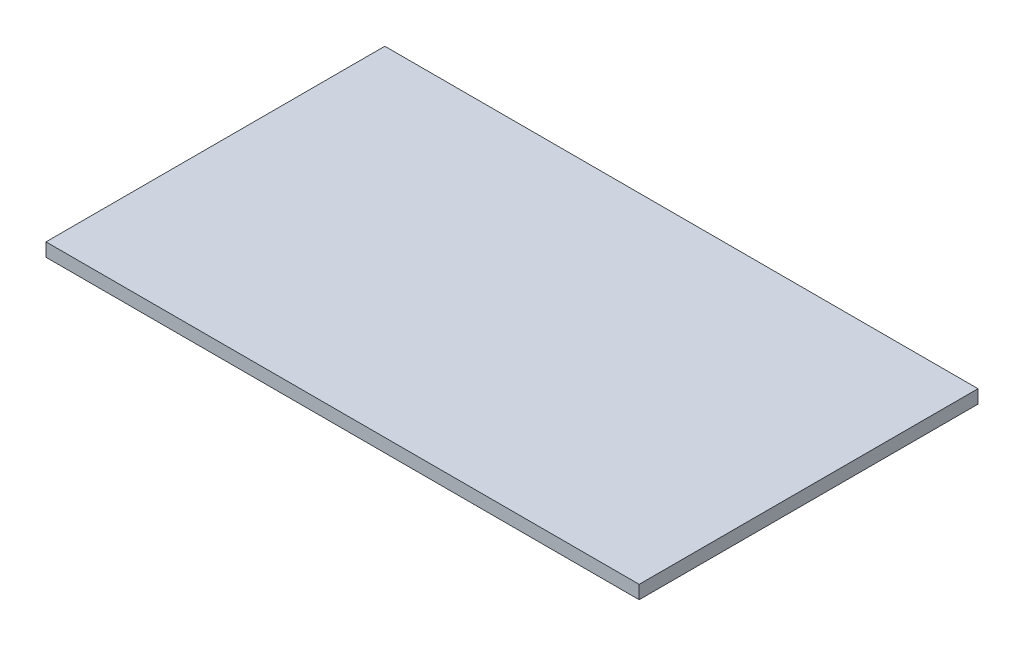
ISO-10303-21;
HEADER;
FILE_DESCRIPTION(('STEP AP214'),'2;1');
FILE_NAME('part.step','',(''),(''),'','','');
FILE_SCHEMA(('AUTOMOTIVE_DESIGN { 1 0 10303 214 1 1 1 1 }'));
ENDSEC;
DATA;
#1=APPLICATION_CONTEXT('core data for automotive mechanical design processes');
#2=APPLICATION_PROTOCOL_DEFINITION('international standard','automotive_design',2000,#1);
#3=PRODUCT_CONTEXT('',#1,'mechanical');
#4=PRODUCT('Part','Part','',(#3));
#5=PRODUCT_RELATED_PRODUCT_CATEGORY('part','',(#4));
#6=PRODUCT_DEFINITION_FORMATION('','',#4);
#7=PRODUCT_DEFINITION_CONTEXT('part definition',#1,'design');
#8=PRODUCT_DEFINITION('design','',#6,#7);
#9=PRODUCT_DEFINITION_SHAPE('','',#8);
#10=(LENGTH_UNIT() NAMED_UNIT(*) SI_UNIT(.MILLI.,.METRE.));
#11=(NAMED_UNIT(*) PLANE_ANGLE_UNIT() SI_UNIT($,.RADIAN.));
#12=(NAMED_UNIT(*) SI_UNIT($,.STERADIAN.) SOLID_ANGLE_UNIT());
#13=UNCERTAINTY_MEASURE_WITH_UNIT(LENGTH_MEASURE(1.E-05),#10,'distance_accuracy_value','');
#14=(GEOMETRIC_REPRESENTATION_CONTEXT(3) GLOBAL_UNCERTAINTY_ASSIGNED_CONTEXT((#13)) GLOBAL_UNIT_ASSIGNED_CONTEXT((#10,
#11,#12)) REPRESENTATION_CONTEXT('',''));
#15=CARTESIAN_POINT('',(0.,0.,0.));
#16=DIRECTION('',(0.,0.,1.));
#17=DIRECTION('',(1.,0.,0.));
#18=AXIS2_PLACEMENT_3D('',#15,#16,#17);
#19=CARTESIAN_POINT('',(-214.35976458526,8.3312,-36.9171322926299));
#20=DIRECTION('',(1.,0.,0.));
#21=DIRECTION('',(0.,0.,-1.));
#22=AXIS2_PLACEMENT_3D('',#19,#20,#21);
#23=PLANE('',#22);
#24=DIRECTION('',(0.,0.,1.));
#25=VECTOR('',#24,1.);
#26=CARTESIAN_POINT('',(-214.35976458526,0.,-36.9171322926299));
#27=LINE('',#26,#25);
#28=CARTESIAN_POINT('',(-214.35976458526,0.,-36.9171322926299));
#29=VERTEX_POINT('',#28);
#30=CARTESIAN_POINT('',(-214.35976458526,0.,173.92826770737));
#31=VERTEX_POINT('',#30);
#32=EDGE_CURVE('E96',#29,#31,#27,.T.);
#33=ORIENTED_EDGE('',*,*,#32,.T.);
#34=DIRECTION('',(0.,-1.,0.));
#35=VECTOR('',#34,1.);
#36=CARTESIAN_POINT('',(-214.35976458526,8.3312,173.92826770737));
#37=LINE('',#36,#35);
#38=CARTESIAN_POINT('',(-214.35976458526,8.3312,173.92826770737));
#39=VERTEX_POINT('',#38);
#40=EDGE_CURVE('E11',#39,#31,#37,.T.);
#41=ORIENTED_EDGE('',*,*,#40,.F.);
#42=DIRECTION('',(0.,0.,1.));
#43=VECTOR('',#42,1.);
#44=CARTESIAN_POINT('',(-214.35976458526,8.3312,-36.9171322926299));
#45=LINE('',#44,#43);
#46=CARTESIAN_POINT('',(-214.35976458526,8.3312,-36.9171322926299));
#47=VERTEX_POINT('',#46);
#48=EDGE_CURVE('E84',#47,#39,#45,.T.);
#49=ORIENTED_EDGE('',*,*,#48,.F.);
#50=DIRECTION('',(0.,-1.,0.));
#51=VECTOR('',#50,1.);
#52=CARTESIAN_POINT('',(-214.35976458526,8.3312,-36.9171322926299));
#53=LINE('',#52,#51);
#54=EDGE_CURVE('E92',#47,#29,#53,.T.);
#55=ORIENTED_EDGE('',*,*,#54,.T.);
#56=EDGE_LOOP('',(#33,#41,#49,#55));
#57=FACE_BOUND('',#56,.T.);
#58=ADVANCED_FACE('F33',(#57),#23,.F.);
#59=CARTESIAN_POINT('',(-214.35976458526,8.3312,173.92826770737));
#60=DIRECTION('',(0.,0.,-1.));
#61=DIRECTION('',(-1.,0.,0.));
#62=AXIS2_PLACEMENT_3D('',#59,#60,#61);
#63=PLANE('',#62);
#64=DIRECTION('',(1.,0.,0.));
#65=VECTOR('',#64,1.);
#66=CARTESIAN_POINT('',(-214.35976458526,0.,173.92826770737));
#67=LINE('',#66,#65);
#68=CARTESIAN_POINT('',(154.76573541474,0.,173.92826770737));
#69=VERTEX_POINT('',#68);
#70=EDGE_CURVE('E88',#31,#69,#67,.T.);
#71=ORIENTED_EDGE('',*,*,#70,.T.);
#72=DIRECTION('',(0.,-1.,0.));
#73=VECTOR('',#72,1.);
#74=CARTESIAN_POINT('',(154.76573541474,8.3312,173.92826770737));
#75=LINE('',#74,#73);
#76=CARTESIAN_POINT('',(154.76573541474,8.3312,173.92826770737));
#77=VERTEX_POINT('',#76);
#78=EDGE_CURVE('E41',#77,#69,#75,.T.);
#79=ORIENTED_EDGE('',*,*,#78,.F.);
#80=DIRECTION('',(1.,0.,0.));
#81=VECTOR('',#80,1.);
#82=CARTESIAN_POINT('',(-214.35976458526,8.3312,173.92826770737));
#83=LINE('',#82,#81);
#84=EDGE_CURVE('E79',#39,#77,#83,.T.);
#85=ORIENTED_EDGE('',*,*,#84,.F.);
#86=ORIENTED_EDGE('',*,*,#40,.T.);
#87=EDGE_LOOP('',(#71,#79,#85,#86));
#88=FACE_BOUND('',#87,.T.);
#89=ADVANCED_FACE('F87',(#88),#63,.F.);
#90=CARTESIAN_POINT('',(154.76573541474,8.3312,-36.9171322926299));
#91=DIRECTION('',(-1.,0.,0.));
#92=DIRECTION('',(0.,0.,1.));
#93=AXIS2_PLACEMENT_3D('',#90,#91,#92);
#94=PLANE('',#93);
#95=DIRECTION('',(0.,0.,-1.));
#96=VECTOR('',#95,1.);
#97=CARTESIAN_POINT('',(154.76573541474,0.,-36.9171322926299));
#98=LINE('',#97,#96);
#99=CARTESIAN_POINT('',(154.76573541474,0.,-36.9171322926299));
#100=VERTEX_POINT('',#99);
#101=EDGE_CURVE('E66',#69,#100,#98,.T.);
#102=ORIENTED_EDGE('',*,*,#101,.T.);
#103=DIRECTION('',(0.,-1.,0.));
#104=VECTOR('',#103,1.);
#105=CARTESIAN_POINT('',(154.76573541474,8.3312,-36.9171322926299));
#106=LINE('',#105,#104);
#107=CARTESIAN_POINT('',(154.76573541474,8.3312,-36.9171322926299));
#108=VERTEX_POINT('',#107);
#109=EDGE_CURVE('E89',#108,#100,#106,.T.);
#110=ORIENTED_EDGE('',*,*,#109,.F.);
#111=DIRECTION('',(0.,0.,-1.));
#112=VECTOR('',#111,1.);
#113=CARTESIAN_POINT('',(154.76573541474,8.3312,-36.9171322926299));
#114=LINE('',#113,#112);
#115=EDGE_CURVE('E82',#77,#108,#114,.T.);
#116=ORIENTED_EDGE('',*,*,#115,.F.);
#117=ORIENTED_EDGE('',*,*,#78,.T.);
#118=EDGE_LOOP('',(#102,#110,#116,#117));
#119=FACE_BOUND('',#118,.T.);
#120=ADVANCED_FACE('F90',(#119),#94,.F.);
#121=CARTESIAN_POINT('',(-214.35976458526,8.3312,-36.9171322926299));
#122=DIRECTION('',(0.,0.,1.));
#123=DIRECTION('',(1.,0.,0.));
#124=AXIS2_PLACEMENT_3D('',#121,#122,#123);
#125=PLANE('',#124);
#126=DIRECTION('',(-1.,0.,0.));
#127=VECTOR('',#126,1.);
#128=CARTESIAN_POINT('',(-214.35976458526,0.,-36.9171322926299));
#129=LINE('',#128,#127);
#130=EDGE_CURVE('E72',#100,#29,#129,.T.);
#131=ORIENTED_EDGE('',*,*,#130,.T.);
#132=ORIENTED_EDGE('',*,*,#54,.F.);
#133=DIRECTION('',(-1.,0.,0.));
#134=VECTOR('',#133,1.);
#135=CARTESIAN_POINT('',(-214.35976458526,8.3312,-36.9171322926299));
#136=LINE('',#135,#134);
#137=EDGE_CURVE('E49',#108,#47,#136,.T.);
#138=ORIENTED_EDGE('',*,*,#137,.F.);
#139=ORIENTED_EDGE('',*,*,#109,.T.);
#140=EDGE_LOOP('',(#131,#132,#138,#139));
#141=FACE_BOUND('',#140,.T.);
#142=ADVANCED_FACE('F103',(#141),#125,.F.);
#143=CARTESIAN_POINT('',(0.,8.3312,0.));
#144=DIRECTION('',(0.,1.,0.));
#145=DIRECTION('',(0.,0.,1.));
#146=AXIS2_PLACEMENT_3D('',#143,#144,#145);
#147=PLANE('',#146);
#148=ORIENTED_EDGE('',*,*,#48,.T.);
#149=ORIENTED_EDGE('',*,*,#84,.T.);
#150=ORIENTED_EDGE('',*,*,#115,.T.);
#151=ORIENTED_EDGE('',*,*,#137,.T.);
#152=EDGE_LOOP('',(#148,#149,#150,#151));
#153=FACE_BOUND('',#152,.T.);
#154=ADVANCED_FACE('F80',(#153),#147,.T.);
#155=CARTESIAN_POINT('',(0.,0.,0.));
#156=DIRECTION('',(0.,1.,0.));
#157=DIRECTION('',(0.,0.,1.));
#158=AXIS2_PLACEMENT_3D('',#155,#156,#157);
#159=PLANE('',#158);
#160=ORIENTED_EDGE('',*,*,#32,.F.);
#161=ORIENTED_EDGE('',*,*,#130,.F.);
#162=ORIENTED_EDGE('',*,*,#101,.F.);
#163=ORIENTED_EDGE('',*,*,#70,.F.);
#164=EDGE_LOOP('',(#160,#161,#162,#163));
#165=FACE_BOUND('',#164,.T.);
#166=ADVANCED_FACE('F106',(#165),#159,.F.);
#167=CLOSED_SHELL('',(#58,#89,#120,#142,#154,#166));
#168=MANIFOLD_SOLID_BREP('B2',#167);
#169=ADVANCED_BREP_SHAPE_REPRESENTATION('',(#18,#168),#14);
#170=SHAPE_DEFINITION_REPRESENTATION(#9,#169);
ENDSEC;
END-ISO-10303-21;
